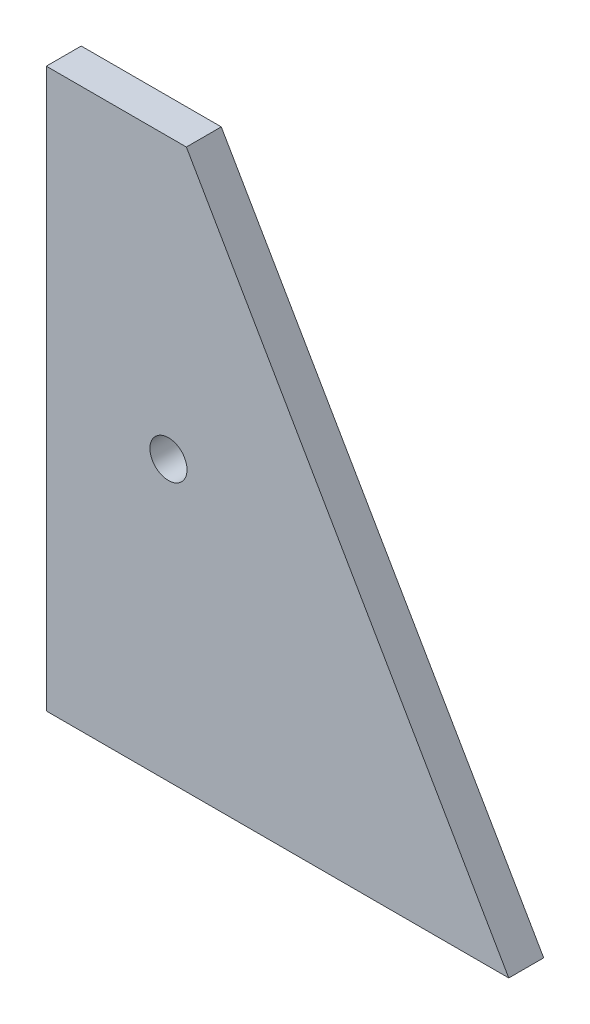
ISO-10303-21;
HEADER;
FILE_DESCRIPTION(('STEP AP214'),'2;1');
FILE_NAME('part.step','',(''),(''),'','','');
FILE_SCHEMA(('AUTOMOTIVE_DESIGN { 1 0 10303 214 1 1 1 1 }'));
ENDSEC;
DATA;
#1=APPLICATION_CONTEXT('core data for automotive mechanical design processes');
#2=APPLICATION_PROTOCOL_DEFINITION('international standard','automotive_design',2000,#1);
#3=PRODUCT_CONTEXT('',#1,'mechanical');
#4=PRODUCT('Part','Part','',(#3));
#5=PRODUCT_RELATED_PRODUCT_CATEGORY('part','',(#4));
#6=PRODUCT_DEFINITION_FORMATION('','',#4);
#7=PRODUCT_DEFINITION_CONTEXT('part definition',#1,'design');
#8=PRODUCT_DEFINITION('design','',#6,#7);
#9=PRODUCT_DEFINITION_SHAPE('','',#8);
#10=(LENGTH_UNIT() NAMED_UNIT(*) SI_UNIT(.MILLI.,.METRE.));
#11=(NAMED_UNIT(*) PLANE_ANGLE_UNIT() SI_UNIT($,.RADIAN.));
#12=(NAMED_UNIT(*) SI_UNIT($,.STERADIAN.) SOLID_ANGLE_UNIT());
#13=UNCERTAINTY_MEASURE_WITH_UNIT(LENGTH_MEASURE(1.E-05),#10,'distance_accuracy_value','');
#14=(GEOMETRIC_REPRESENTATION_CONTEXT(3) GLOBAL_UNCERTAINTY_ASSIGNED_CONTEXT((#13)) GLOBAL_UNIT_ASSIGNED_CONTEXT((#10,
#11,#12)) REPRESENTATION_CONTEXT('',''));
#15=CARTESIAN_POINT('',(0.,0.,0.));
#16=DIRECTION('',(0.,0.,1.));
#17=DIRECTION('',(1.,0.,0.));
#18=AXIS2_PLACEMENT_3D('',#15,#16,#17);
#19=CARTESIAN_POINT('',(0.,0.,6.35));
#20=DIRECTION('',(0.,0.,-1.));
#21=DIRECTION('',(-1.,0.,0.));
#22=AXIS2_PLACEMENT_3D('',#19,#20,#21);
#23=PLANE('',#22);
#24=DIRECTION('',(1.,0.,0.));
#25=VECTOR('',#24,1.);
#26=CARTESIAN_POINT('',(168.275,0.,6.35));
#27=LINE('',#26,#25);
#28=CARTESIAN_POINT('',(0.,0.,6.35));
#29=VERTEX_POINT('',#28);
#30=CARTESIAN_POINT('',(168.275,0.,6.35));
#31=VERTEX_POINT('',#30);
#32=EDGE_CURVE('E93',#29,#31,#27,.T.);
#33=ORIENTED_EDGE('',*,*,#32,.T.);
#34=DIRECTION('',(-0.500000000000004,0.866025403784436,0.));
#35=VECTOR('',#34,1.);
#36=CARTESIAN_POINT('',(50.9574253006667,203.2,6.35));
#37=LINE('',#36,#35);
#38=CARTESIAN_POINT('',(50.9574253006667,203.2,6.35));
#39=VERTEX_POINT('',#38);
#40=EDGE_CURVE('E88',#31,#39,#37,.T.);
#41=ORIENTED_EDGE('',*,*,#40,.T.);
#42=DIRECTION('',(-1.,0.,0.));
#43=VECTOR('',#42,1.);
#44=CARTESIAN_POINT('',(50.9574253006667,203.2,6.35));
#45=LINE('',#44,#43);
#46=CARTESIAN_POINT('',(0.,203.2,6.35));
#47=VERTEX_POINT('',#46);
#48=EDGE_CURVE('E91',#39,#47,#45,.T.);
#49=ORIENTED_EDGE('',*,*,#48,.T.);
#50=DIRECTION('',(0.,-1.,0.));
#51=VECTOR('',#50,1.);
#52=CARTESIAN_POINT('',(0.,0.,6.35));
#53=LINE('',#52,#51);
#54=EDGE_CURVE('E58',#47,#29,#53,.T.);
#55=ORIENTED_EDGE('',*,*,#54,.T.);
#56=EDGE_LOOP('',(#33,#41,#49,#55));
#57=FACE_BOUND('',#56,.T.);
#58=CARTESIAN_POINT('',(44.45,101.6,6.35));
#59=DIRECTION('',(0.,0.,1.));
#60=DIRECTION('',(1.,0.,0.));
#61=AXIS2_PLACEMENT_3D('',#58,#59,#60);
#62=CIRCLE('',#61,6.74623999999999);
#63=CARTESIAN_POINT('',(51.19624,101.6,6.35));
#64=VERTEX_POINT('',#63);
#65=EDGE_CURVE('E122',#64,#64,#62,.T.);
#66=ORIENTED_EDGE('',*,*,#65,.F.);
#67=EDGE_LOOP('',(#66));
#68=FACE_BOUND('',#67,.T.);
#69=ADVANCED_FACE('F41',(#57,#68),#23,.F.);
#70=CARTESIAN_POINT('',(0.,0.,-6.35));
#71=DIRECTION('',(0.,0.,-1.));
#72=DIRECTION('',(-1.,0.,0.));
#73=AXIS2_PLACEMENT_3D('',#70,#71,#72);
#74=PLANE('',#73);
#75=DIRECTION('',(1.,0.,0.));
#76=VECTOR('',#75,1.);
#77=CARTESIAN_POINT('',(168.275,0.,-6.35));
#78=LINE('',#77,#76);
#79=CARTESIAN_POINT('',(0.,0.,-6.35));
#80=VERTEX_POINT('',#79);
#81=CARTESIAN_POINT('',(168.275,0.,-6.35));
#82=VERTEX_POINT('',#81);
#83=EDGE_CURVE('E105',#80,#82,#78,.T.);
#84=ORIENTED_EDGE('',*,*,#83,.F.);
#85=DIRECTION('',(0.,-1.,0.));
#86=VECTOR('',#85,1.);
#87=CARTESIAN_POINT('',(0.,0.,-6.35));
#88=LINE('',#87,#86);
#89=CARTESIAN_POINT('',(0.,203.2,-6.35));
#90=VERTEX_POINT('',#89);
#91=EDGE_CURVE('E81',#90,#80,#88,.T.);
#92=ORIENTED_EDGE('',*,*,#91,.F.);
#93=DIRECTION('',(-1.,0.,0.));
#94=VECTOR('',#93,1.);
#95=CARTESIAN_POINT('',(50.9574253006667,203.2,-6.35));
#96=LINE('',#95,#94);
#97=CARTESIAN_POINT('',(50.9574253006667,203.2,-6.35));
#98=VERTEX_POINT('',#97);
#99=EDGE_CURVE('E75',#98,#90,#96,.T.);
#100=ORIENTED_EDGE('',*,*,#99,.F.);
#101=DIRECTION('',(-0.500000000000004,0.866025403784436,0.));
#102=VECTOR('',#101,1.);
#103=CARTESIAN_POINT('',(50.9574253006667,203.2,-6.35));
#104=LINE('',#103,#102);
#105=EDGE_CURVE('E97',#82,#98,#104,.T.);
#106=ORIENTED_EDGE('',*,*,#105,.F.);
#107=EDGE_LOOP('',(#84,#92,#100,#106));
#108=FACE_BOUND('',#107,.T.);
#109=CARTESIAN_POINT('',(44.45,101.6,-6.35));
#110=DIRECTION('',(0.,0.,1.));
#111=DIRECTION('',(1.,0.,0.));
#112=AXIS2_PLACEMENT_3D('',#109,#110,#111);
#113=CIRCLE('',#112,6.74624);
#114=CARTESIAN_POINT('',(51.19624,101.6,-6.35));
#115=VERTEX_POINT('',#114);
#116=EDGE_CURVE('E108',#115,#115,#113,.T.);
#117=ORIENTED_EDGE('',*,*,#116,.T.);
#118=EDGE_LOOP('',(#117));
#119=FACE_BOUND('',#118,.T.);
#120=ADVANCED_FACE('F116',(#108,#119),#74,.T.);
#121=CARTESIAN_POINT('',(168.275,0.,6.35));
#122=DIRECTION('',(0.,1.,0.));
#123=DIRECTION('',(-1.,0.,0.));
#124=AXIS2_PLACEMENT_3D('',#121,#122,#123);
#125=PLANE('',#124);
#126=ORIENTED_EDGE('',*,*,#83,.T.);
#127=DIRECTION('',(0.,0.,-1.));
#128=VECTOR('',#127,1.);
#129=CARTESIAN_POINT('',(168.275,0.,6.35));
#130=LINE('',#129,#128);
#131=EDGE_CURVE('E11',#31,#82,#130,.T.);
#132=ORIENTED_EDGE('',*,*,#131,.F.);
#133=ORIENTED_EDGE('',*,*,#32,.F.);
#134=DIRECTION('',(0.,0.,-1.));
#135=VECTOR('',#134,1.);
#136=CARTESIAN_POINT('',(0.,0.,6.35));
#137=LINE('',#136,#135);
#138=EDGE_CURVE('E101',#29,#80,#137,.T.);
#139=ORIENTED_EDGE('',*,*,#138,.T.);
#140=EDGE_LOOP('',(#126,#132,#133,#139));
#141=FACE_BOUND('',#140,.T.);
#142=ADVANCED_FACE('F43',(#141),#125,.F.);
#143=CARTESIAN_POINT('',(50.9574253006667,203.2,6.35));
#144=DIRECTION('',(-0.866025403784436,-0.500000000000004,0.));
#145=DIRECTION('',(0.500000000000004,-0.866025403784436,0.));
#146=AXIS2_PLACEMENT_3D('',#143,#144,#145);
#147=PLANE('',#146);
#148=ORIENTED_EDGE('',*,*,#105,.T.);
#149=DIRECTION('',(0.,0.,-1.));
#150=VECTOR('',#149,1.);
#151=CARTESIAN_POINT('',(50.9574253006667,203.2,6.35));
#152=LINE('',#151,#150);
#153=EDGE_CURVE('E50',#39,#98,#152,.T.);
#154=ORIENTED_EDGE('',*,*,#153,.F.);
#155=ORIENTED_EDGE('',*,*,#40,.F.);
#156=ORIENTED_EDGE('',*,*,#131,.T.);
#157=EDGE_LOOP('',(#148,#154,#155,#156));
#158=FACE_BOUND('',#157,.T.);
#159=ADVANCED_FACE('F96',(#158),#147,.F.);
#160=CARTESIAN_POINT('',(50.9574253006667,203.2,6.35));
#161=DIRECTION('',(0.,-1.,0.));
#162=DIRECTION('',(1.,0.,0.));
#163=AXIS2_PLACEMENT_3D('',#160,#161,#162);
#164=PLANE('',#163);
#165=ORIENTED_EDGE('',*,*,#99,.T.);
#166=DIRECTION('',(0.,0.,-1.));
#167=VECTOR('',#166,1.);
#168=CARTESIAN_POINT('',(0.,203.2,6.35));
#169=LINE('',#168,#167);
#170=EDGE_CURVE('E98',#47,#90,#169,.T.);
#171=ORIENTED_EDGE('',*,*,#170,.F.);
#172=ORIENTED_EDGE('',*,*,#48,.F.);
#173=ORIENTED_EDGE('',*,*,#153,.T.);
#174=EDGE_LOOP('',(#165,#171,#172,#173));
#175=FACE_BOUND('',#174,.T.);
#176=ADVANCED_FACE('F99',(#175),#164,.F.);
#177=CARTESIAN_POINT('',(0.,0.,6.35));
#178=DIRECTION('',(1.,0.,0.));
#179=DIRECTION('',(0.,0.,-1.));
#180=AXIS2_PLACEMENT_3D('',#177,#178,#179);
#181=PLANE('',#180);
#182=ORIENTED_EDGE('',*,*,#91,.T.);
#183=ORIENTED_EDGE('',*,*,#138,.F.);
#184=ORIENTED_EDGE('',*,*,#54,.F.);
#185=ORIENTED_EDGE('',*,*,#170,.T.);
#186=EDGE_LOOP('',(#182,#183,#184,#185));
#187=FACE_BOUND('',#186,.T.);
#188=ADVANCED_FACE('F113',(#187),#181,.F.);
#189=CARTESIAN_POINT('',(44.45,101.6,6.35));
#190=DIRECTION('',(0.,0.,1.));
#191=DIRECTION('',(1.,0.,0.));
#192=AXIS2_PLACEMENT_3D('',#189,#190,#191);
#193=CYLINDRICAL_SURFACE('',#192,6.74623999999999);
#194=ORIENTED_EDGE('',*,*,#116,.F.);
#195=EDGE_LOOP('',(#194));
#196=FACE_BOUND('',#195,.T.);
#197=ORIENTED_EDGE('',*,*,#65,.T.);
#198=EDGE_LOOP('',(#197));
#199=FACE_BOUND('',#198,.T.);
#200=ADVANCED_FACE('F126',(#196,#199),#193,.F.);
#201=CLOSED_SHELL('',(#69,#120,#142,#159,#176,#188,#200));
#202=MANIFOLD_SOLID_BREP('B2',#201);
#203=ADVANCED_BREP_SHAPE_REPRESENTATION('',(#18,#202),#14);
#204=SHAPE_DEFINITION_REPRESENTATION(#9,#203);
ENDSEC;
END-ISO-10303-21;
